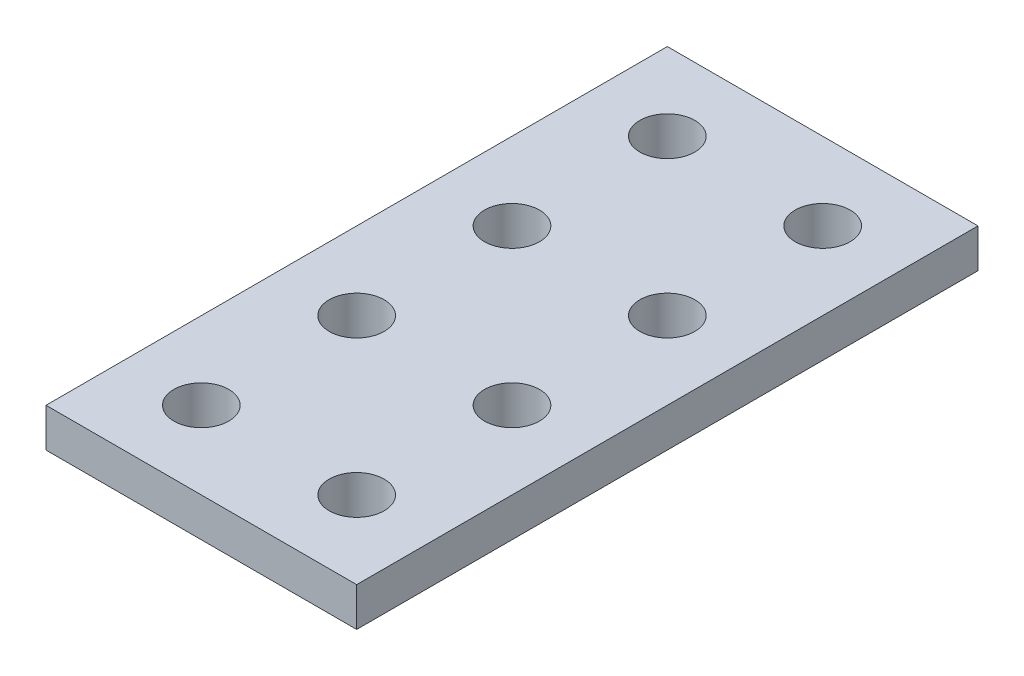
ISO-10303-21;
HEADER;
FILE_DESCRIPTION(('STEP AP214'),'2;1');
FILE_NAME('part.step','',(''),(''),'','','');
FILE_SCHEMA(('AUTOMOTIVE_DESIGN { 1 0 10303 214 1 1 1 1 }'));
ENDSEC;
DATA;
#1=APPLICATION_CONTEXT('core data for automotive mechanical design processes');
#2=APPLICATION_PROTOCOL_DEFINITION('international standard','automotive_design',2000,#1);
#3=PRODUCT_CONTEXT('',#1,'mechanical');
#4=PRODUCT('Part','Part','',(#3));
#5=PRODUCT_RELATED_PRODUCT_CATEGORY('part','',(#4));
#6=PRODUCT_DEFINITION_FORMATION('','',#4);
#7=PRODUCT_DEFINITION_CONTEXT('part definition',#1,'design');
#8=PRODUCT_DEFINITION('design','',#6,#7);
#9=PRODUCT_DEFINITION_SHAPE('','',#8);
#10=(LENGTH_UNIT() NAMED_UNIT(*) SI_UNIT(.MILLI.,.METRE.));
#11=(NAMED_UNIT(*) PLANE_ANGLE_UNIT() SI_UNIT($,.RADIAN.));
#12=(NAMED_UNIT(*) SI_UNIT($,.STERADIAN.) SOLID_ANGLE_UNIT());
#13=UNCERTAINTY_MEASURE_WITH_UNIT(LENGTH_MEASURE(1.E-05),#10,'distance_accuracy_value','');
#14=(GEOMETRIC_REPRESENTATION_CONTEXT(3) GLOBAL_UNCERTAINTY_ASSIGNED_CONTEXT((#13)) GLOBAL_UNIT_ASSIGNED_CONTEXT((#10,
#11,#12)) REPRESENTATION_CONTEXT('',''));
#15=CARTESIAN_POINT('',(0.,0.,0.));
#16=DIRECTION('',(0.,0.,1.));
#17=DIRECTION('',(1.,0.,0.));
#18=AXIS2_PLACEMENT_3D('',#15,#16,#17);
#19=CARTESIAN_POINT('',(0.,3.175,0.));
#20=DIRECTION('',(0.,1.,0.));
#21=DIRECTION('',(0.,0.,1.));
#22=AXIS2_PLACEMENT_3D('',#19,#20,#21);
#23=PLANE('',#22);
#24=CARTESIAN_POINT('',(6.35,3.175,31.75));
#25=DIRECTION('',(0.,1.,0.));
#26=DIRECTION('',(0.,0.,1.));
#27=AXIS2_PLACEMENT_3D('',#24,#25,#26);
#28=CIRCLE('',#27,2.24789999999917);
#29=CARTESIAN_POINT('',(6.35,3.175,33.9978999999992));
#30=VERTEX_POINT('',#29);
#31=EDGE_CURVE('E153',#30,#30,#28,.T.);
#32=ORIENTED_EDGE('',*,*,#31,.F.);
#33=EDGE_LOOP('',(#32));
#34=FACE_BOUND('',#33,.T.);
#35=CARTESIAN_POINT('',(19.0499999999997,3.175,44.4499999999998));
#36=DIRECTION('',(0.,1.,0.));
#37=DIRECTION('',(0.,0.,1.));
#38=AXIS2_PLACEMENT_3D('',#35,#36,#37);
#39=CIRCLE('',#38,2.24790000000044);
#40=CARTESIAN_POINT('',(19.0499999999997,3.175,46.6979000000003));
#41=VERTEX_POINT('',#40);
#42=EDGE_CURVE('E141',#41,#41,#39,.T.);
#43=ORIENTED_EDGE('',*,*,#42,.F.);
#44=EDGE_LOOP('',(#43));
#45=FACE_BOUND('',#44,.T.);
#46=CARTESIAN_POINT('',(19.0499999999997,3.175,19.0499999999998));
#47=DIRECTION('',(0.,1.,0.));
#48=DIRECTION('',(0.,0.,1.));
#49=AXIS2_PLACEMENT_3D('',#46,#47,#48);
#50=CIRCLE('',#49,2.24789999999917);
#51=CARTESIAN_POINT('',(19.0499999999997,3.175,21.297899999999));
#52=VERTEX_POINT('',#51);
#53=EDGE_CURVE('E129',#52,#52,#50,.T.);
#54=ORIENTED_EDGE('',*,*,#53,.F.);
#55=EDGE_LOOP('',(#54));
#56=FACE_BOUND('',#55,.T.);
#57=CARTESIAN_POINT('',(6.35,3.175,6.35));
#58=DIRECTION('',(0.,1.,0.));
#59=DIRECTION('',(0.,0.,1.));
#60=AXIS2_PLACEMENT_3D('',#57,#58,#59);
#61=CIRCLE('',#60,2.24789999999791);
#62=CARTESIAN_POINT('',(6.35,3.175,8.59789999999791));
#63=VERTEX_POINT('',#62);
#64=EDGE_CURVE('E108',#63,#63,#61,.T.);
#65=ORIENTED_EDGE('',*,*,#64,.F.);
#66=EDGE_LOOP('',(#65));
#67=FACE_BOUND('',#66,.T.);
#68=DIRECTION('',(0.,0.,1.));
#69=VECTOR('',#68,1.);
#70=CARTESIAN_POINT('',(0.,3.175,0.));
#71=LINE('',#70,#69);
#72=CARTESIAN_POINT('',(0.,3.175,0.));
#73=VERTEX_POINT('',#72);
#74=CARTESIAN_POINT('',(0.,3.175,50.8));
#75=VERTEX_POINT('',#74);
#76=EDGE_CURVE('E93',#73,#75,#71,.T.);
#77=ORIENTED_EDGE('',*,*,#76,.T.);
#78=DIRECTION('',(1.,0.,0.));
#79=VECTOR('',#78,1.);
#80=CARTESIAN_POINT('',(0.,3.175,50.8));
#81=LINE('',#80,#79);
#82=CARTESIAN_POINT('',(25.4,3.175,50.8));
#83=VERTEX_POINT('',#82);
#84=EDGE_CURVE('E88',#75,#83,#81,.T.);
#85=ORIENTED_EDGE('',*,*,#84,.T.);
#86=DIRECTION('',(0.,0.,-1.));
#87=VECTOR('',#86,1.);
#88=CARTESIAN_POINT('',(25.4,3.175,0.));
#89=LINE('',#88,#87);
#90=CARTESIAN_POINT('',(25.4,3.175,0.));
#91=VERTEX_POINT('',#90);
#92=EDGE_CURVE('E91',#83,#91,#89,.T.);
#93=ORIENTED_EDGE('',*,*,#92,.T.);
#94=DIRECTION('',(-1.,0.,0.));
#95=VECTOR('',#94,1.);
#96=CARTESIAN_POINT('',(0.,3.175,0.));
#97=LINE('',#96,#95);
#98=EDGE_CURVE('E58',#91,#73,#97,.T.);
#99=ORIENTED_EDGE('',*,*,#98,.T.);
#100=EDGE_LOOP('',(#77,#85,#93,#99));
#101=FACE_BOUND('',#100,.T.);
#102=CARTESIAN_POINT('',(19.0499999999997,3.175,6.34999999999982));
#103=DIRECTION('',(0.,1.,0.));
#104=DIRECTION('',(0.,0.,1.));
#105=AXIS2_PLACEMENT_3D('',#102,#103,#104);
#106=CIRCLE('',#105,2.24789999999849);
#107=CARTESIAN_POINT('',(19.0499999999997,3.175,8.59789999999832));
#108=VERTEX_POINT('',#107);
#109=EDGE_CURVE('E123',#108,#108,#106,.T.);
#110=ORIENTED_EDGE('',*,*,#109,.F.);
#111=EDGE_LOOP('',(#110));
#112=FACE_BOUND('',#111,.T.);
#113=CARTESIAN_POINT('',(19.0499999999997,3.175,31.7499999999998));
#114=DIRECTION('',(0.,1.,0.));
#115=DIRECTION('',(0.,0.,1.));
#116=AXIS2_PLACEMENT_3D('',#113,#114,#115);
#117=CIRCLE('',#116,2.24789999999981);
#118=CARTESIAN_POINT('',(19.0499999999997,3.175,33.9978999999996));
#119=VERTEX_POINT('',#118);
#120=EDGE_CURVE('E135',#119,#119,#117,.T.);
#121=ORIENTED_EDGE('',*,*,#120,.F.);
#122=EDGE_LOOP('',(#121));
#123=FACE_BOUND('',#122,.T.);
#124=CARTESIAN_POINT('',(6.35,3.175,19.05));
#125=DIRECTION('',(0.,1.,0.));
#126=DIRECTION('',(0.,0.,1.));
#127=AXIS2_PLACEMENT_3D('',#124,#125,#126);
#128=CIRCLE('',#127,2.24789999999854);
#129=CARTESIAN_POINT('',(6.35,3.175,21.2978999999985));
#130=VERTEX_POINT('',#129);
#131=EDGE_CURVE('E147',#130,#130,#128,.T.);
#132=ORIENTED_EDGE('',*,*,#131,.F.);
#133=EDGE_LOOP('',(#132));
#134=FACE_BOUND('',#133,.T.);
#135=CARTESIAN_POINT('',(6.35,3.175,44.45));
#136=DIRECTION('',(0.,1.,0.));
#137=DIRECTION('',(0.,0.,1.));
#138=AXIS2_PLACEMENT_3D('',#135,#136,#137);
#139=CIRCLE('',#138,2.24789999999981);
#140=CARTESIAN_POINT('',(6.35,3.175,46.6978999999998));
#141=VERTEX_POINT('',#140);
#142=EDGE_CURVE('E159',#141,#141,#139,.T.);
#143=ORIENTED_EDGE('',*,*,#142,.F.);
#144=EDGE_LOOP('',(#143));
#145=FACE_BOUND('',#144,.T.);
#146=ADVANCED_FACE('F41',(#34,#45,#56,#67,#101,#112,#123,#134,#145),#23,.T.);
#147=CARTESIAN_POINT('',(0.,0.,0.));
#148=DIRECTION('',(0.,1.,0.));
#149=DIRECTION('',(0.,0.,1.));
#150=AXIS2_PLACEMENT_3D('',#147,#148,#149);
#151=PLANE('',#150);
#152=DIRECTION('',(0.,0.,1.));
#153=VECTOR('',#152,1.);
#154=CARTESIAN_POINT('',(0.,0.,0.));
#155=LINE('',#154,#153);
#156=CARTESIAN_POINT('',(0.,0.,0.));
#157=VERTEX_POINT('',#156);
#158=CARTESIAN_POINT('',(0.,0.,50.8));
#159=VERTEX_POINT('',#158);
#160=EDGE_CURVE('E105',#157,#159,#155,.T.);
#161=ORIENTED_EDGE('',*,*,#160,.F.);
#162=DIRECTION('',(-1.,0.,0.));
#163=VECTOR('',#162,1.);
#164=CARTESIAN_POINT('',(0.,0.,0.));
#165=LINE('',#164,#163);
#166=CARTESIAN_POINT('',(25.4,0.,0.));
#167=VERTEX_POINT('',#166);
#168=EDGE_CURVE('E81',#167,#157,#165,.T.);
#169=ORIENTED_EDGE('',*,*,#168,.F.);
#170=DIRECTION('',(0.,0.,-1.));
#171=VECTOR('',#170,1.);
#172=CARTESIAN_POINT('',(25.4,0.,0.));
#173=LINE('',#172,#171);
#174=CARTESIAN_POINT('',(25.4,0.,50.8));
#175=VERTEX_POINT('',#174);
#176=EDGE_CURVE('E75',#175,#167,#173,.T.);
#177=ORIENTED_EDGE('',*,*,#176,.F.);
#178=DIRECTION('',(1.,0.,0.));
#179=VECTOR('',#178,1.);
#180=CARTESIAN_POINT('',(0.,0.,50.8));
#181=LINE('',#180,#179);
#182=EDGE_CURVE('E97',#159,#175,#181,.T.);
#183=ORIENTED_EDGE('',*,*,#182,.F.);
#184=EDGE_LOOP('',(#161,#169,#177,#183));
#185=FACE_BOUND('',#184,.T.);
#186=CARTESIAN_POINT('',(6.35,0.,6.35));
#187=DIRECTION('',(0.,1.,0.));
#188=DIRECTION('',(0.,0.,1.));
#189=AXIS2_PLACEMENT_3D('',#186,#187,#188);
#190=CIRCLE('',#189,2.24789999999791);
#191=CARTESIAN_POINT('',(6.35,0.,8.59789999999791));
#192=VERTEX_POINT('',#191);
#193=EDGE_CURVE('E120',#192,#192,#190,.T.);
#194=ORIENTED_EDGE('',*,*,#193,.T.);
#195=EDGE_LOOP('',(#194));
#196=FACE_BOUND('',#195,.T.);
#197=CARTESIAN_POINT('',(19.0499999999997,0.,6.34999999999982));
#198=DIRECTION('',(0.,1.,0.));
#199=DIRECTION('',(0.,0.,1.));
#200=AXIS2_PLACEMENT_3D('',#197,#198,#199);
#201=CIRCLE('',#200,2.24789999999849);
#202=CARTESIAN_POINT('',(19.0499999999997,0.,8.59789999999832));
#203=VERTEX_POINT('',#202);
#204=EDGE_CURVE('E126',#203,#203,#201,.T.);
#205=ORIENTED_EDGE('',*,*,#204,.T.);
#206=EDGE_LOOP('',(#205));
#207=FACE_BOUND('',#206,.T.);
#208=CARTESIAN_POINT('',(19.0499999999997,0.,19.0499999999998));
#209=DIRECTION('',(0.,1.,0.));
#210=DIRECTION('',(0.,0.,1.));
#211=AXIS2_PLACEMENT_3D('',#208,#209,#210);
#212=CIRCLE('',#211,2.24789999999917);
#213=CARTESIAN_POINT('',(19.0499999999997,0.,21.297899999999));
#214=VERTEX_POINT('',#213);
#215=EDGE_CURVE('E132',#214,#214,#212,.T.);
#216=ORIENTED_EDGE('',*,*,#215,.T.);
#217=EDGE_LOOP('',(#216));
#218=FACE_BOUND('',#217,.T.);
#219=CARTESIAN_POINT('',(19.0499999999997,0.,31.7499999999998));
#220=DIRECTION('',(0.,1.,0.));
#221=DIRECTION('',(0.,0.,1.));
#222=AXIS2_PLACEMENT_3D('',#219,#220,#221);
#223=CIRCLE('',#222,2.24789999999981);
#224=CARTESIAN_POINT('',(19.0499999999997,0.,33.9978999999996));
#225=VERTEX_POINT('',#224);
#226=EDGE_CURVE('E138',#225,#225,#223,.T.);
#227=ORIENTED_EDGE('',*,*,#226,.T.);
#228=EDGE_LOOP('',(#227));
#229=FACE_BOUND('',#228,.T.);
#230=CARTESIAN_POINT('',(19.0499999999997,0.,44.4499999999998));
#231=DIRECTION('',(0.,1.,0.));
#232=DIRECTION('',(0.,0.,1.));
#233=AXIS2_PLACEMENT_3D('',#230,#231,#232);
#234=CIRCLE('',#233,2.24790000000044);
#235=CARTESIAN_POINT('',(19.0499999999997,0.,46.6979000000003));
#236=VERTEX_POINT('',#235);
#237=EDGE_CURVE('E144',#236,#236,#234,.T.);
#238=ORIENTED_EDGE('',*,*,#237,.T.);
#239=EDGE_LOOP('',(#238));
#240=FACE_BOUND('',#239,.T.);
#241=CARTESIAN_POINT('',(6.35,0.,19.05));
#242=DIRECTION('',(0.,1.,0.));
#243=DIRECTION('',(0.,0.,1.));
#244=AXIS2_PLACEMENT_3D('',#241,#242,#243);
#245=CIRCLE('',#244,2.24789999999854);
#246=CARTESIAN_POINT('',(6.35,0.,21.2978999999985));
#247=VERTEX_POINT('',#246);
#248=EDGE_CURVE('E150',#247,#247,#245,.T.);
#249=ORIENTED_EDGE('',*,*,#248,.T.);
#250=EDGE_LOOP('',(#249));
#251=FACE_BOUND('',#250,.T.);
#252=CARTESIAN_POINT('',(6.35,0.,31.75));
#253=DIRECTION('',(0.,1.,0.));
#254=DIRECTION('',(0.,0.,1.));
#255=AXIS2_PLACEMENT_3D('',#252,#253,#254);
#256=CIRCLE('',#255,2.24789999999917);
#257=CARTESIAN_POINT('',(6.35,0.,33.9978999999992));
#258=VERTEX_POINT('',#257);
#259=EDGE_CURVE('E156',#258,#258,#256,.T.);
#260=ORIENTED_EDGE('',*,*,#259,.T.);
#261=EDGE_LOOP('',(#260));
#262=FACE_BOUND('',#261,.T.);
#263=CARTESIAN_POINT('',(6.35,0.,44.45));
#264=DIRECTION('',(0.,1.,0.));
#265=DIRECTION('',(0.,0.,1.));
#266=AXIS2_PLACEMENT_3D('',#263,#264,#265);
#267=CIRCLE('',#266,2.24789999999981);
#268=CARTESIAN_POINT('',(6.35,0.,46.6978999999998));
#269=VERTEX_POINT('',#268);
#270=EDGE_CURVE('E162',#269,#269,#267,.T.);
#271=ORIENTED_EDGE('',*,*,#270,.T.);
#272=EDGE_LOOP('',(#271));
#273=FACE_BOUND('',#272,.T.);
#274=ADVANCED_FACE('F116',(#185,#196,#207,#218,#229,#240,#251,#262,#273),#151,.F.);
#275=CARTESIAN_POINT('',(0.,3.175,0.));
#276=DIRECTION('',(1.,0.,0.));
#277=DIRECTION('',(0.,0.,-1.));
#278=AXIS2_PLACEMENT_3D('',#275,#276,#277);
#279=PLANE('',#278);
#280=ORIENTED_EDGE('',*,*,#160,.T.);
#281=DIRECTION('',(0.,-1.,0.));
#282=VECTOR('',#281,1.);
#283=CARTESIAN_POINT('',(0.,3.175,50.8));
#284=LINE('',#283,#282);
#285=EDGE_CURVE('E11',#75,#159,#284,.T.);
#286=ORIENTED_EDGE('',*,*,#285,.F.);
#287=ORIENTED_EDGE('',*,*,#76,.F.);
#288=DIRECTION('',(0.,-1.,0.));
#289=VECTOR('',#288,1.);
#290=CARTESIAN_POINT('',(0.,3.175,0.));
#291=LINE('',#290,#289);
#292=EDGE_CURVE('E101',#73,#157,#291,.T.);
#293=ORIENTED_EDGE('',*,*,#292,.T.);
#294=EDGE_LOOP('',(#280,#286,#287,#293));
#295=FACE_BOUND('',#294,.T.);
#296=ADVANCED_FACE('F43',(#295),#279,.F.);
#297=CARTESIAN_POINT('',(0.,3.175,50.8));
#298=DIRECTION('',(0.,0.,-1.));
#299=DIRECTION('',(-1.,0.,0.));
#300=AXIS2_PLACEMENT_3D('',#297,#298,#299);
#301=PLANE('',#300);
#302=ORIENTED_EDGE('',*,*,#182,.T.);
#303=DIRECTION('',(0.,-1.,0.));
#304=VECTOR('',#303,1.);
#305=CARTESIAN_POINT('',(25.4,3.175,50.8));
#306=LINE('',#305,#304);
#307=EDGE_CURVE('E50',#83,#175,#306,.T.);
#308=ORIENTED_EDGE('',*,*,#307,.F.);
#309=ORIENTED_EDGE('',*,*,#84,.F.);
#310=ORIENTED_EDGE('',*,*,#285,.T.);
#311=EDGE_LOOP('',(#302,#308,#309,#310));
#312=FACE_BOUND('',#311,.T.);
#313=ADVANCED_FACE('F96',(#312),#301,.F.);
#314=CARTESIAN_POINT('',(25.4,3.175,0.));
#315=DIRECTION('',(-1.,0.,0.));
#316=DIRECTION('',(0.,0.,1.));
#317=AXIS2_PLACEMENT_3D('',#314,#315,#316);
#318=PLANE('',#317);
#319=ORIENTED_EDGE('',*,*,#176,.T.);
#320=DIRECTION('',(0.,-1.,0.));
#321=VECTOR('',#320,1.);
#322=CARTESIAN_POINT('',(25.4,3.175,0.));
#323=LINE('',#322,#321);
#324=EDGE_CURVE('E98',#91,#167,#323,.T.);
#325=ORIENTED_EDGE('',*,*,#324,.F.);
#326=ORIENTED_EDGE('',*,*,#92,.F.);
#327=ORIENTED_EDGE('',*,*,#307,.T.);
#328=EDGE_LOOP('',(#319,#325,#326,#327));
#329=FACE_BOUND('',#328,.T.);
#330=ADVANCED_FACE('F99',(#329),#318,.F.);
#331=CARTESIAN_POINT('',(0.,3.175,0.));
#332=DIRECTION('',(0.,0.,1.));
#333=DIRECTION('',(1.,0.,0.));
#334=AXIS2_PLACEMENT_3D('',#331,#332,#333);
#335=PLANE('',#334);
#336=ORIENTED_EDGE('',*,*,#168,.T.);
#337=ORIENTED_EDGE('',*,*,#292,.F.);
#338=ORIENTED_EDGE('',*,*,#98,.F.);
#339=ORIENTED_EDGE('',*,*,#324,.T.);
#340=EDGE_LOOP('',(#336,#337,#338,#339));
#341=FACE_BOUND('',#340,.T.);
#342=ADVANCED_FACE('F113',(#341),#335,.F.);
#343=CARTESIAN_POINT('',(6.35,3.175,6.35));
#344=DIRECTION('',(0.,-1.,0.));
#345=DIRECTION('',(0.,0.,-1.));
#346=AXIS2_PLACEMENT_3D('',#343,#344,#345);
#347=CYLINDRICAL_SURFACE('',#346,2.24789999999791);
#348=ORIENTED_EDGE('',*,*,#64,.T.);
#349=EDGE_LOOP('',(#348));
#350=FACE_BOUND('',#349,.T.);
#351=ORIENTED_EDGE('',*,*,#193,.F.);
#352=EDGE_LOOP('',(#351));
#353=FACE_BOUND('',#352,.T.);
#354=ADVANCED_FACE('F181',(#350,#353),#347,.F.);
#355=CARTESIAN_POINT('',(19.0499999999997,3.175,6.34999999999982));
#356=DIRECTION('',(0.,-1.,0.));
#357=DIRECTION('',(0.,0.,-1.));
#358=AXIS2_PLACEMENT_3D('',#355,#356,#357);
#359=CYLINDRICAL_SURFACE('',#358,2.24789999999849);
#360=ORIENTED_EDGE('',*,*,#109,.T.);
#361=EDGE_LOOP('',(#360));
#362=FACE_BOUND('',#361,.T.);
#363=ORIENTED_EDGE('',*,*,#204,.F.);
#364=EDGE_LOOP('',(#363));
#365=FACE_BOUND('',#364,.T.);
#366=ADVANCED_FACE('F235',(#362,#365),#359,.F.);
#367=CARTESIAN_POINT('',(19.0499999999997,3.175,19.0499999999998));
#368=DIRECTION('',(0.,-1.,0.));
#369=DIRECTION('',(0.,0.,-1.));
#370=AXIS2_PLACEMENT_3D('',#367,#368,#369);
#371=CYLINDRICAL_SURFACE('',#370,2.24789999999917);
#372=ORIENTED_EDGE('',*,*,#53,.T.);
#373=EDGE_LOOP('',(#372));
#374=FACE_BOUND('',#373,.T.);
#375=ORIENTED_EDGE('',*,*,#215,.F.);
#376=EDGE_LOOP('',(#375));
#377=FACE_BOUND('',#376,.T.);
#378=ADVANCED_FACE('F244',(#374,#377),#371,.F.);
#379=CARTESIAN_POINT('',(19.0499999999997,3.175,31.7499999999998));
#380=DIRECTION('',(0.,-1.,0.));
#381=DIRECTION('',(0.,0.,-1.));
#382=AXIS2_PLACEMENT_3D('',#379,#380,#381);
#383=CYLINDRICAL_SURFACE('',#382,2.24789999999981);
#384=ORIENTED_EDGE('',*,*,#120,.T.);
#385=EDGE_LOOP('',(#384));
#386=FACE_BOUND('',#385,.T.);
#387=ORIENTED_EDGE('',*,*,#226,.F.);
#388=EDGE_LOOP('',(#387));
#389=FACE_BOUND('',#388,.T.);
#390=ADVANCED_FACE('F253',(#386,#389),#383,.F.);
#391=CARTESIAN_POINT('',(19.0499999999997,3.175,44.4499999999998));
#392=DIRECTION('',(0.,-1.,0.));
#393=DIRECTION('',(0.,0.,-1.));
#394=AXIS2_PLACEMENT_3D('',#391,#392,#393);
#395=CYLINDRICAL_SURFACE('',#394,2.24790000000044);
#396=ORIENTED_EDGE('',*,*,#42,.T.);
#397=EDGE_LOOP('',(#396));
#398=FACE_BOUND('',#397,.T.);
#399=ORIENTED_EDGE('',*,*,#237,.F.);
#400=EDGE_LOOP('',(#399));
#401=FACE_BOUND('',#400,.T.);
#402=ADVANCED_FACE('F263',(#398,#401),#395,.F.);
#403=CARTESIAN_POINT('',(6.35,3.175,19.05));
#404=DIRECTION('',(0.,-1.,0.));
#405=DIRECTION('',(0.,0.,-1.));
#406=AXIS2_PLACEMENT_3D('',#403,#404,#405);
#407=CYLINDRICAL_SURFACE('',#406,2.24789999999854);
#408=ORIENTED_EDGE('',*,*,#131,.T.);
#409=EDGE_LOOP('',(#408));
#410=FACE_BOUND('',#409,.T.);
#411=ORIENTED_EDGE('',*,*,#248,.F.);
#412=EDGE_LOOP('',(#411));
#413=FACE_BOUND('',#412,.T.);
#414=ADVANCED_FACE('F273',(#410,#413),#407,.F.);
#415=CARTESIAN_POINT('',(6.35,3.175,31.75));
#416=DIRECTION('',(0.,-1.,0.));
#417=DIRECTION('',(0.,0.,-1.));
#418=AXIS2_PLACEMENT_3D('',#415,#416,#417);
#419=CYLINDRICAL_SURFACE('',#418,2.24789999999917);
#420=ORIENTED_EDGE('',*,*,#31,.T.);
#421=EDGE_LOOP('',(#420));
#422=FACE_BOUND('',#421,.T.);
#423=ORIENTED_EDGE('',*,*,#259,.F.);
#424=EDGE_LOOP('',(#423));
#425=FACE_BOUND('',#424,.T.);
#426=ADVANCED_FACE('F283',(#422,#425),#419,.F.);
#427=CARTESIAN_POINT('',(6.35,3.175,44.45));
#428=DIRECTION('',(0.,-1.,0.));
#429=DIRECTION('',(0.,0.,-1.));
#430=AXIS2_PLACEMENT_3D('',#427,#428,#429);
#431=CYLINDRICAL_SURFACE('',#430,2.24789999999981);
#432=ORIENTED_EDGE('',*,*,#142,.T.);
#433=EDGE_LOOP('',(#432));
#434=FACE_BOUND('',#433,.T.);
#435=ORIENTED_EDGE('',*,*,#270,.F.);
#436=EDGE_LOOP('',(#435));
#437=FACE_BOUND('',#436,.T.);
#438=ADVANCED_FACE('F168',(#434,#437),#431,.F.);
#439=CLOSED_SHELL('',(#146,#274,#296,#313,#330,#342,#354,#366,#378,#390,#402,#414,#426,#438));
#440=MANIFOLD_SOLID_BREP('B2',#439);
#441=ADVANCED_BREP_SHAPE_REPRESENTATION('',(#18,#440),#14);
#442=SHAPE_DEFINITION_REPRESENTATION(#9,#441);
ENDSEC;
END-ISO-10303-21;
